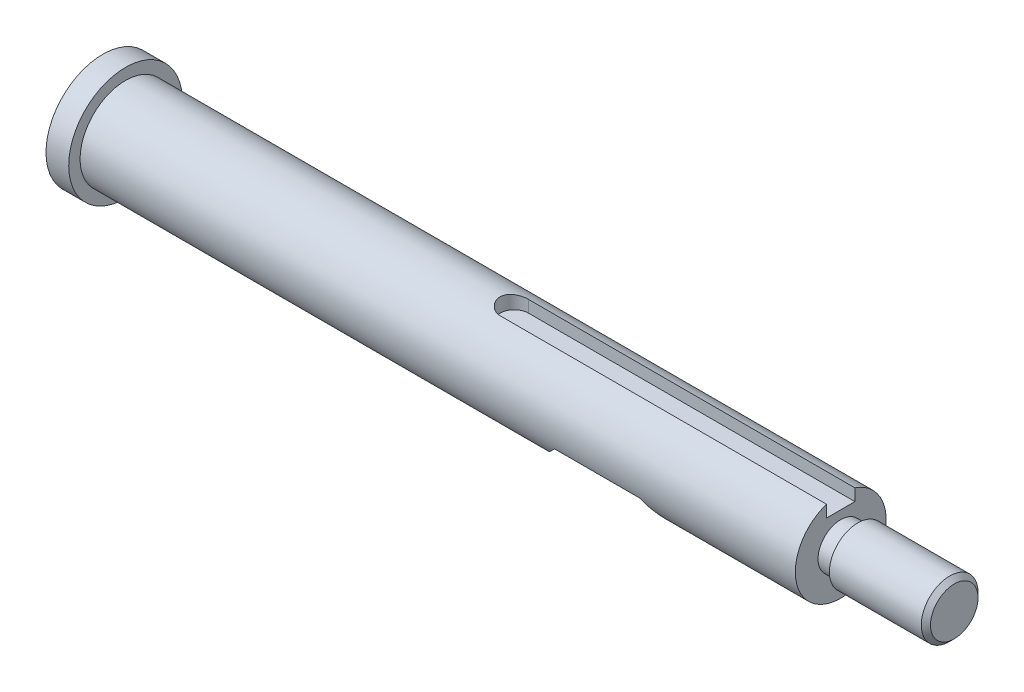
ISO-10303-21;
HEADER;
FILE_DESCRIPTION(('STEP AP214'),'2;1');
FILE_NAME('part.step','',(''),(''),'','','');
FILE_SCHEMA(('AUTOMOTIVE_DESIGN { 1 0 10303 214 1 1 1 1 }'));
ENDSEC;
DATA;
#1=APPLICATION_CONTEXT('core data for automotive mechanical design processes');
#2=APPLICATION_PROTOCOL_DEFINITION('international standard','automotive_design',2000,#1);
#3=PRODUCT_CONTEXT('',#1,'mechanical');
#4=PRODUCT('Part','Part','',(#3));
#5=PRODUCT_RELATED_PRODUCT_CATEGORY('part','',(#4));
#6=PRODUCT_DEFINITION_FORMATION('','',#4);
#7=PRODUCT_DEFINITION_CONTEXT('part definition',#1,'design');
#8=PRODUCT_DEFINITION('design','',#6,#7);
#9=PRODUCT_DEFINITION_SHAPE('','',#8);
#10=(LENGTH_UNIT() NAMED_UNIT(*) SI_UNIT(.MILLI.,.METRE.));
#11=(NAMED_UNIT(*) PLANE_ANGLE_UNIT() SI_UNIT($,.RADIAN.));
#12=(NAMED_UNIT(*) SI_UNIT($,.STERADIAN.) SOLID_ANGLE_UNIT());
#13=UNCERTAINTY_MEASURE_WITH_UNIT(LENGTH_MEASURE(1.E-05),#10,'distance_accuracy_value','');
#14=(GEOMETRIC_REPRESENTATION_CONTEXT(3) GLOBAL_UNCERTAINTY_ASSIGNED_CONTEXT((#13)) GLOBAL_UNIT_ASSIGNED_CONTEXT((#10,
#11,#12)) REPRESENTATION_CONTEXT('',''));
#15=CARTESIAN_POINT('',(0.,0.,0.));
#16=DIRECTION('',(0.,0.,1.));
#17=DIRECTION('',(1.,0.,0.));
#18=AXIS2_PLACEMENT_3D('',#15,#16,#17);
#19=CARTESIAN_POINT('',(0.,0.,0.));
#20=DIRECTION('',(-1.,0.,0.));
#21=DIRECTION('',(0.,0.,1.));
#22=AXIS2_PLACEMENT_3D('',#19,#20,#21);
#23=CYLINDRICAL_SURFACE('',#22,8.);
#24=CARTESIAN_POINT('',(90.,0.,0.));
#25=DIRECTION('',(-0.70710678118655,0.707106781186545,0.));
#26=DIRECTION('',(-0.707106781186545,-0.70710678118655,0.));
#27=AXIS2_PLACEMENT_3D('',#24,#25,#26);
#28=ELLIPSE('',#27,11.3137084989847,8.);
#29=CARTESIAN_POINT('',(87.,-3.,-7.4161984870956));
#30=VERTEX_POINT('',#29);
#31=CARTESIAN_POINT('',(87.,-3.,7.4161984870956));
#32=VERTEX_POINT('',#31);
#33=EDGE_CURVE('E11',#30,#32,#28,.T.);
#34=ORIENTED_EDGE('',*,*,#33,.T.);
#35=DIRECTION('',(-1.,0.,0.));
#36=VECTOR('',#35,1.);
#37=CARTESIAN_POINT('',(0.,-3.00000000000014,7.41619848709561));
#38=LINE('',#37,#36);
#39=CARTESIAN_POINT('',(102.,-2.99999999999998,7.41619848709568));
#40=VERTEX_POINT('',#39);
#41=EDGE_CURVE('E104',#32,#40,#38,.F.);
#42=ORIENTED_EDGE('',*,*,#41,.T.);
#43=CARTESIAN_POINT('',(99.,0.,0.));
#44=DIRECTION('',(0.707106781186549,0.707106781186547,0.));
#45=DIRECTION('',(-0.707106781186547,0.707106781186549,0.));
#46=AXIS2_PLACEMENT_3D('',#43,#44,#45);
#47=ELLIPSE('',#46,11.3137084989847,8.);
#48=CARTESIAN_POINT('',(102.,-2.99999999999998,-7.41619848709568));
#49=VERTEX_POINT('',#48);
#50=EDGE_CURVE('E99',#40,#49,#47,.T.);
#51=ORIENTED_EDGE('',*,*,#50,.T.);
#52=DIRECTION('',(-1.,0.,0.));
#53=VECTOR('',#52,1.);
#54=CARTESIAN_POINT('',(0.,-3.00000000000014,-7.41619848709561));
#55=LINE('',#54,#53);
#56=EDGE_CURVE('E53',#49,#30,#55,.T.);
#57=ORIENTED_EDGE('',*,*,#56,.T.);
#58=EDGE_LOOP('',(#34,#42,#51,#57));
#59=FACE_BOUND('',#58,.T.);
#60=CARTESIAN_POINT('',(4.,0.,0.));
#61=DIRECTION('',(-1.,0.,0.));
#62=DIRECTION('',(0.,0.,1.));
#63=AXIS2_PLACEMENT_3D('',#60,#61,#62);
#64=CIRCLE('',#63,8.);
#65=CARTESIAN_POINT('',(4.,0.,8.));
#66=VERTEX_POINT('',#65);
#67=EDGE_CURVE('E193',#66,#66,#64,.T.);
#68=ORIENTED_EDGE('',*,*,#67,.F.);
#69=EDGE_LOOP('',(#68));
#70=FACE_BOUND('',#69,.T.);
#71=DIRECTION('',(-1.,0.,0.));
#72=VECTOR('',#71,1.);
#73=CARTESIAN_POINT('',(0.,7.59934207678534,-2.49999999999998));
#74=LINE('',#73,#72);
#75=CARTESIAN_POINT('',(130.,7.59934207678533,-2.5));
#76=VERTEX_POINT('',#75);
#77=CARTESIAN_POINT('',(72.5,7.59934207678533,-2.50000000000001));
#78=VERTEX_POINT('',#77);
#79=EDGE_CURVE('E210',#76,#78,#74,.T.);
#80=ORIENTED_EDGE('',*,*,#79,.F.);
#81=CARTESIAN_POINT('',(130.,0.,0.));
#82=DIRECTION('',(-1.,0.,0.));
#83=DIRECTION('',(0.,0.,1.));
#84=AXIS2_PLACEMENT_3D('',#81,#82,#83);
#85=CIRCLE('',#84,8.);
#86=CARTESIAN_POINT('',(130.,7.59934207678533,2.5));
#87=VERTEX_POINT('',#86);
#88=EDGE_CURVE('E180',#76,#87,#85,.T.);
#89=ORIENTED_EDGE('',*,*,#88,.T.);
#90=DIRECTION('',(-1.,0.,0.));
#91=VECTOR('',#90,1.);
#92=CARTESIAN_POINT('',(0.,7.59934207678533,2.50000000000002));
#93=LINE('',#92,#91);
#94=CARTESIAN_POINT('',(72.5,7.59934207678533,2.50000000000001));
#95=VERTEX_POINT('',#94);
#96=EDGE_CURVE('E212',#95,#87,#93,.F.);
#97=ORIENTED_EDGE('',*,*,#96,.F.);
#98=CARTESIAN_POINT('',(72.5,7.59934207678533,-2.50000000000001));
#99=CARTESIAN_POINT('',(72.4315339595421,7.59933203220922,-2.50000871986612));
#100=CARTESIAN_POINT('',(72.3630736199714,7.60026710840752,-2.49718761570671));
#101=CARTESIAN_POINT('',(72.2266785097404,7.60395280971297,-2.48595363160139));
#102=CARTESIAN_POINT('',(72.1587436164041,7.60670299725467,-2.47754209932594));
#103=CARTESIAN_POINT('',(72.0240610094842,7.61393458112745,-2.45522504986813));
#104=CARTESIAN_POINT('',(71.9573105997033,7.61841131278036,-2.44133433374919));
#105=CARTESIAN_POINT('',(71.8252980221065,7.6289504842887,-2.40819742021323));
#106=CARTESIAN_POINT('',(71.7600358985911,7.63501297127917,-2.38895106360389));
#107=CARTESIAN_POINT('',(71.5672122235932,7.65531370854753,-2.32342181812058));
#108=CARTESIAN_POINT('',(71.4424319419261,7.67167572075674,-2.26931834783615));
#109=CARTESIAN_POINT('',(71.2037124302177,7.70820192005305,-2.14195853375281));
#110=CARTESIAN_POINT('',(71.0897788745153,7.72836808096862,-2.06869223942945));
#111=CARTESIAN_POINT('',(70.8720500238271,7.77100200100207,-1.90239488450143));
#112=CARTESIAN_POINT('',(70.7686777356114,7.79352168290434,-1.80882220629732));
#113=CARTESIAN_POINT('',(70.5788091827044,7.83788426191899,-1.60572727956464));
#114=CARTESIAN_POINT('',(70.4923158216107,7.85972704204464,-1.49620229248913));
#115=CARTESIAN_POINT('',(70.3367767359159,7.90087147079049,-1.26124953771774));
#116=CARTESIAN_POINT('',(70.2681699526331,7.92010445950432,-1.13551807880449));
#117=CARTESIAN_POINT('',(70.1532459150217,7.95325160259884,-0.873602960335176));
#118=CARTESIAN_POINT('',(70.106922529715,7.96716721976608,-0.737422187737953));
#119=CARTESIAN_POINT('',(70.0392981140108,7.98774341182992,-0.462930099012002));
#120=CARTESIAN_POINT('',(70.0172689552531,7.99461464054537,-0.324814247508671));
#121=CARTESIAN_POINT('',(69.9965512744954,8.00107192504111,-0.0466844774607953));
#122=CARTESIAN_POINT('',(69.9978579200948,8.00065948912979,0.0933290421121628));
#123=CARTESIAN_POINT('',(70.0232966545975,7.99274230032515,0.366149731450015));
#124=CARTESIAN_POINT('',(70.0466390281483,7.98548293529422,0.499038795981156));
#125=CARTESIAN_POINT('',(70.1141904955611,7.96498949974384,0.758907586787312));
#126=CARTESIAN_POINT('',(70.1584007112687,7.95175510801139,0.885886994958708));
#127=CARTESIAN_POINT('',(70.2669406330596,7.92046911120711,1.13215685546552));
#128=CARTESIAN_POINT('',(70.33151017529,7.90236047967987,1.25133405945159));
#129=CARTESIAN_POINT('',(70.478743196476,7.86323423851861,1.47740616192354));
#130=CARTESIAN_POINT('',(70.5614110607507,7.84221592430771,1.58429807402892));
#131=CARTESIAN_POINT('',(70.7465381363962,7.79847545376802,1.78746586607461));
#132=CARTESIAN_POINT('',(70.8496774077316,7.77571879037653,1.88311543585897));
#133=CARTESIAN_POINT('',(71.0707703101051,7.73181622612155,2.05596538849194));
#134=CARTESIAN_POINT('',(71.1887283888502,7.71067081193134,2.13316021206708));
#135=CARTESIAN_POINT('',(71.4379029431862,7.67220528704822,2.26764925997604));
#136=CARTESIAN_POINT('',(71.569258301466,7.65493278862476,2.32470027293309));
#137=CARTESIAN_POINT('',(71.8403118730475,7.62673815128782,2.41560912229749));
#138=CARTESIAN_POINT('',(71.9799968306881,7.61580620458632,2.4495027938281));
#139=CARTESIAN_POINT('',(72.1841751010083,7.60564225124819,2.48078343133094));
#140=CARTESIAN_POINT('',(72.2471449369419,7.60328541577438,2.48798807259047));
#141=CARTESIAN_POINT('',(72.3733989933458,7.60013482131108,2.49759244704774));
#142=CARTESIAN_POINT('',(72.4366826427974,7.59933885501906,2.49999896558959));
#143=CARTESIAN_POINT('',(72.5,7.59934207678533,2.49999999999999));
#144=B_SPLINE_CURVE_WITH_KNOTS('',3,(#98,#99,#100,#101,#102,#103,#104,#105,#106,#107,#108,#109,
#110,#111,#112,#113,#114,#115,#116,#117,#118,#119,#120,#121,#122,#123,#124,#125,#126,#127,#128,
#129,#130,#131,#132,#133,#134,#135,#136,#137,#138,#139,#140,#141,#142,#143),.UNSPECIFIED.,.F.,
.F.,(4,2,2,2,2,2,2,2,2,2,2,2,2,2,2,2,2,2,2,2,2,2,4),(0.,0.205323959879004,0.410598440771317,
0.615322164613769,0.820051974362703,1.22896577749256,1.63809233699274,2.05988351400979,
2.48174718582287,2.91315381297357,3.34444167638914,3.7624189439242,4.18030965733328,
4.58377069824371,4.98725343150324,5.39567896994656,5.80420358180208,6.2297165423683,
6.6553575226076,7.08597472101491,7.51592403685478,7.70602799872318,7.89586293072483),.UNSPECIFIED.);
#145=EDGE_CURVE('E105',#78,#95,#144,.T.);
#146=ORIENTED_EDGE('',*,*,#145,.F.);
#147=EDGE_LOOP('',(#80,#89,#97,#146));
#148=FACE_BOUND('',#147,.T.);
#149=ADVANCED_FACE('F45',(#59,#70,#148),#23,.T.);
#150=CARTESIAN_POINT('',(130.,8.,0.));
#151=DIRECTION('',(-1.,0.,0.));
#152=DIRECTION('',(0.,0.,1.));
#153=AXIS2_PLACEMENT_3D('',#150,#151,#152);
#154=PLANE('',#153);
#155=CARTESIAN_POINT('',(130.,0.,0.));
#156=DIRECTION('',(-1.,0.,0.));
#157=DIRECTION('',(0.,0.,1.));
#158=AXIS2_PLACEMENT_3D('',#155,#156,#157);
#159=CIRCLE('',#158,4.);
#160=CARTESIAN_POINT('',(130.,0.,4.));
#161=VERTEX_POINT('',#160);
#162=EDGE_CURVE('E173',#161,#161,#159,.T.);
#163=ORIENTED_EDGE('',*,*,#162,.T.);
#164=EDGE_LOOP('',(#163));
#165=FACE_BOUND('',#164,.T.);
#166=DIRECTION('',(0.,1.,0.));
#167=VECTOR('',#166,1.);
#168=CARTESIAN_POINT('',(130.,8.,-2.5));
#169=LINE('',#168,#167);
#170=CARTESIAN_POINT('',(130.,5.5,-2.5));
#171=VERTEX_POINT('',#170);
#172=EDGE_CURVE('E124',#171,#76,#169,.T.);
#173=ORIENTED_EDGE('',*,*,#172,.F.);
#174=DIRECTION('',(0.,0.,-1.));
#175=VECTOR('',#174,1.);
#176=CARTESIAN_POINT('',(130.,5.5,0.));
#177=LINE('',#176,#175);
#178=CARTESIAN_POINT('',(130.,5.5,2.50000000000001));
#179=VERTEX_POINT('',#178);
#180=EDGE_CURVE('E178',#179,#171,#177,.T.);
#181=ORIENTED_EDGE('',*,*,#180,.F.);
#182=DIRECTION('',(0.,-1.,0.));
#183=VECTOR('',#182,1.);
#184=CARTESIAN_POINT('',(130.,8.,2.5));
#185=LINE('',#184,#183);
#186=EDGE_CURVE('E183',#87,#179,#185,.T.);
#187=ORIENTED_EDGE('',*,*,#186,.F.);
#188=ORIENTED_EDGE('',*,*,#88,.F.);
#189=EDGE_LOOP('',(#173,#181,#187,#188));
#190=FACE_BOUND('',#189,.T.);
#191=ADVANCED_FACE('F161',(#165,#190),#154,.F.);
#192=CARTESIAN_POINT('',(0.,0.,0.));
#193=DIRECTION('',(1.,0.,0.));
#194=DIRECTION('',(0.,0.,-1.));
#195=AXIS2_PLACEMENT_3D('',#192,#193,#194);
#196=PLANE('',#195);
#197=CARTESIAN_POINT('',(0.,0.,0.));
#198=DIRECTION('',(-1.,0.,0.));
#199=DIRECTION('',(0.,0.,1.));
#200=AXIS2_PLACEMENT_3D('',#197,#198,#199);
#201=CIRCLE('',#200,5.09999999999999);
#202=CARTESIAN_POINT('',(0.,0.,5.09999999999999));
#203=VERTEX_POINT('',#202);
#204=EDGE_CURVE('E227',#203,#203,#201,.T.);
#205=ORIENTED_EDGE('',*,*,#204,.F.);
#206=EDGE_LOOP('',(#205));
#207=FACE_BOUND('',#206,.T.);
#208=CARTESIAN_POINT('',(0.,0.,0.));
#209=DIRECTION('',(-1.,0.,0.));
#210=DIRECTION('',(0.,0.,1.));
#211=AXIS2_PLACEMENT_3D('',#208,#209,#210);
#212=CIRCLE('',#211,10.);
#213=CARTESIAN_POINT('',(0.,0.,10.));
#214=VERTEX_POINT('',#213);
#215=EDGE_CURVE('E185',#214,#214,#212,.T.);
#216=ORIENTED_EDGE('',*,*,#215,.T.);
#217=EDGE_LOOP('',(#216));
#218=FACE_BOUND('',#217,.T.);
#219=ADVANCED_FACE('F47',(#207,#218),#196,.F.);
#220=CARTESIAN_POINT('',(0.,0.,0.));
#221=DIRECTION('',(-1.,0.,0.));
#222=DIRECTION('',(0.,0.,1.));
#223=AXIS2_PLACEMENT_3D('',#220,#221,#222);
#224=CYLINDRICAL_SURFACE('',#223,10.);
#225=ORIENTED_EDGE('',*,*,#215,.F.);
#226=EDGE_LOOP('',(#225));
#227=FACE_BOUND('',#226,.T.);
#228=CARTESIAN_POINT('',(4.,0.,0.));
#229=DIRECTION('',(-1.,0.,0.));
#230=DIRECTION('',(0.,0.,1.));
#231=AXIS2_PLACEMENT_3D('',#228,#229,#230);
#232=CIRCLE('',#231,10.);
#233=CARTESIAN_POINT('',(4.,0.,10.));
#234=VERTEX_POINT('',#233);
#235=EDGE_CURVE('E190',#234,#234,#232,.T.);
#236=ORIENTED_EDGE('',*,*,#235,.T.);
#237=EDGE_LOOP('',(#236));
#238=FACE_BOUND('',#237,.T.);
#239=ADVANCED_FACE('F167',(#227,#238),#224,.T.);
#240=CARTESIAN_POINT('',(4.,10.,0.));
#241=DIRECTION('',(-1.,0.,0.));
#242=DIRECTION('',(0.,0.,1.));
#243=AXIS2_PLACEMENT_3D('',#240,#241,#242);
#244=PLANE('',#243);
#245=ORIENTED_EDGE('',*,*,#235,.F.);
#246=EDGE_LOOP('',(#245));
#247=FACE_BOUND('',#246,.T.);
#248=ORIENTED_EDGE('',*,*,#67,.T.);
#249=EDGE_LOOP('',(#248));
#250=FACE_BOUND('',#249,.T.);
#251=ADVANCED_FACE('F159',(#247,#250),#244,.F.);
#252=CARTESIAN_POINT('',(0.,0.,0.));
#253=DIRECTION('',(-1.,0.,0.));
#254=DIRECTION('',(0.,0.,1.));
#255=AXIS2_PLACEMENT_3D('',#252,#253,#254);
#256=CYLINDRICAL_SURFACE('',#255,4.);
#257=ORIENTED_EDGE('',*,*,#162,.F.);
#258=EDGE_LOOP('',(#257));
#259=FACE_BOUND('',#258,.T.);
#260=CARTESIAN_POINT('',(133.,0.,0.));
#261=DIRECTION('',(-1.,0.,0.));
#262=DIRECTION('',(0.,0.,1.));
#263=AXIS2_PLACEMENT_3D('',#260,#261,#262);
#264=CIRCLE('',#263,4.);
#265=CARTESIAN_POINT('',(133.,0.,4.));
#266=VERTEX_POINT('',#265);
#267=EDGE_CURVE('E198',#266,#266,#264,.T.);
#268=ORIENTED_EDGE('',*,*,#267,.T.);
#269=EDGE_LOOP('',(#268));
#270=FACE_BOUND('',#269,.T.);
#271=ADVANCED_FACE('F156',(#259,#270),#256,.T.);
#272=CARTESIAN_POINT('',(133.,4.,0.));
#273=DIRECTION('',(1.,0.,0.));
#274=DIRECTION('',(0.,0.,-1.));
#275=AXIS2_PLACEMENT_3D('',#272,#273,#274);
#276=PLANE('',#275);
#277=ORIENTED_EDGE('',*,*,#267,.F.);
#278=EDGE_LOOP('',(#277));
#279=FACE_BOUND('',#278,.T.);
#280=CARTESIAN_POINT('',(133.,0.,0.));
#281=DIRECTION('',(-1.,0.,0.));
#282=DIRECTION('',(0.,0.,1.));
#283=AXIS2_PLACEMENT_3D('',#280,#281,#282);
#284=CIRCLE('',#283,5.);
#285=CARTESIAN_POINT('',(133.,0.,5.));
#286=VERTEX_POINT('',#285);
#287=EDGE_CURVE('E201',#286,#286,#284,.T.);
#288=ORIENTED_EDGE('',*,*,#287,.T.);
#289=EDGE_LOOP('',(#288));
#290=FACE_BOUND('',#289,.T.);
#291=ADVANCED_FACE('F152',(#279,#290),#276,.F.);
#292=CARTESIAN_POINT('',(0.,0.,0.));
#293=DIRECTION('',(-1.,0.,0.));
#294=DIRECTION('',(0.,0.,1.));
#295=AXIS2_PLACEMENT_3D('',#292,#293,#294);
#296=CYLINDRICAL_SURFACE('',#295,5.);
#297=CARTESIAN_POINT('',(149.188,0.,0.));
#298=DIRECTION('',(-1.,0.,0.));
#299=DIRECTION('',(0.,0.,1.));
#300=AXIS2_PLACEMENT_3D('',#297,#298,#299);
#301=CIRCLE('',#300,5.);
#302=CARTESIAN_POINT('',(149.188,0.,5.));
#303=VERTEX_POINT('',#302);
#304=EDGE_CURVE('E204',#303,#303,#301,.T.);
#305=ORIENTED_EDGE('',*,*,#304,.T.);
#306=EDGE_LOOP('',(#305));
#307=FACE_BOUND('',#306,.T.);
#308=ORIENTED_EDGE('',*,*,#287,.F.);
#309=EDGE_LOOP('',(#308));
#310=FACE_BOUND('',#309,.T.);
#311=ADVANCED_FACE('F145',(#307,#310),#296,.T.);
#312=CARTESIAN_POINT('',(150.,0.,0.));
#313=DIRECTION('',(-1.,0.,0.));
#314=DIRECTION('',(0.,0.,1.));
#315=AXIS2_PLACEMENT_3D('',#312,#313,#314);
#316=CONICAL_SURFACE('',#315,4.188,0.785398163397459);
#317=ORIENTED_EDGE('',*,*,#304,.F.);
#318=EDGE_LOOP('',(#317));
#319=FACE_BOUND('',#318,.T.);
#320=CARTESIAN_POINT('',(150.,0.,0.));
#321=DIRECTION('',(-1.,0.,0.));
#322=DIRECTION('',(0.,0.,1.));
#323=AXIS2_PLACEMENT_3D('',#320,#321,#322);
#324=CIRCLE('',#323,4.188);
#325=CARTESIAN_POINT('',(150.,0.,4.188));
#326=VERTEX_POINT('',#325);
#327=EDGE_CURVE('E207',#326,#326,#324,.T.);
#328=ORIENTED_EDGE('',*,*,#327,.T.);
#329=EDGE_LOOP('',(#328));
#330=FACE_BOUND('',#329,.T.);
#331=ADVANCED_FACE('F142',(#319,#330),#316,.T.);
#332=CARTESIAN_POINT('',(150.,5.,0.));
#333=DIRECTION('',(-1.,0.,0.));
#334=DIRECTION('',(0.,0.,1.));
#335=AXIS2_PLACEMENT_3D('',#332,#333,#334);
#336=PLANE('',#335);
#337=ORIENTED_EDGE('',*,*,#327,.F.);
#338=EDGE_LOOP('',(#337));
#339=FACE_BOUND('',#338,.T.);
#340=ADVANCED_FACE('F135',(#339),#336,.F.);
#341=CARTESIAN_POINT('',(72.5,10.,0.));
#342=DIRECTION('',(0.,-1.,0.));
#343=DIRECTION('',(0.,0.,-1.));
#344=AXIS2_PLACEMENT_3D('',#341,#342,#343);
#345=CYLINDRICAL_SURFACE('',#344,2.5);
#346=ORIENTED_EDGE('',*,*,#145,.T.);
#347=DIRECTION('',(0.,-1.,0.));
#348=VECTOR('',#347,1.);
#349=CARTESIAN_POINT('',(72.5,10.,2.50000000000001));
#350=LINE('',#349,#348);
#351=CARTESIAN_POINT('',(72.5,5.5,2.50000000000001));
#352=VERTEX_POINT('',#351);
#353=EDGE_CURVE('E216',#95,#352,#350,.T.);
#354=ORIENTED_EDGE('',*,*,#353,.T.);
#355=CARTESIAN_POINT('',(72.5,5.5,0.));
#356=DIRECTION('',(0.,1.,0.));
#357=DIRECTION('',(0.,0.,1.));
#358=AXIS2_PLACEMENT_3D('',#355,#356,#357);
#359=CIRCLE('',#358,2.5);
#360=CARTESIAN_POINT('',(72.5,5.5,-2.50000000000001));
#361=VERTEX_POINT('',#360);
#362=EDGE_CURVE('E219',#361,#352,#359,.T.);
#363=ORIENTED_EDGE('',*,*,#362,.F.);
#364=DIRECTION('',(0.,-1.,0.));
#365=VECTOR('',#364,1.);
#366=CARTESIAN_POINT('',(72.5,10.,-2.50000000000001));
#367=LINE('',#366,#365);
#368=EDGE_CURVE('E214',#78,#361,#367,.T.);
#369=ORIENTED_EDGE('',*,*,#368,.F.);
#370=EDGE_LOOP('',(#346,#354,#363,#369));
#371=FACE_BOUND('',#370,.T.);
#372=ADVANCED_FACE('F129',(#371),#345,.F.);
#373=CARTESIAN_POINT('',(130.,10.,-2.5));
#374=DIRECTION('',(0.,0.,1.));
#375=DIRECTION('',(1.,0.,0.));
#376=AXIS2_PLACEMENT_3D('',#373,#374,#375);
#377=PLANE('',#376);
#378=ORIENTED_EDGE('',*,*,#79,.T.);
#379=ORIENTED_EDGE('',*,*,#368,.T.);
#380=DIRECTION('',(-1.,0.,0.));
#381=VECTOR('',#380,1.);
#382=CARTESIAN_POINT('',(130.,5.5,-2.5));
#383=LINE('',#382,#381);
#384=EDGE_CURVE('E221',#171,#361,#383,.T.);
#385=ORIENTED_EDGE('',*,*,#384,.F.);
#386=ORIENTED_EDGE('',*,*,#172,.T.);
#387=EDGE_LOOP('',(#378,#379,#385,#386));
#388=FACE_BOUND('',#387,.T.);
#389=ADVANCED_FACE('F134',(#388),#377,.T.);
#390=CARTESIAN_POINT('',(130.,10.,2.5));
#391=DIRECTION('',(0.,0.,-1.));
#392=DIRECTION('',(-1.,0.,0.));
#393=AXIS2_PLACEMENT_3D('',#390,#391,#392);
#394=PLANE('',#393);
#395=ORIENTED_EDGE('',*,*,#96,.T.);
#396=ORIENTED_EDGE('',*,*,#186,.T.);
#397=DIRECTION('',(1.,0.,0.));
#398=VECTOR('',#397,1.);
#399=CARTESIAN_POINT('',(130.,5.5,2.5));
#400=LINE('',#399,#398);
#401=EDGE_CURVE('E67',#352,#179,#400,.T.);
#402=ORIENTED_EDGE('',*,*,#401,.F.);
#403=ORIENTED_EDGE('',*,*,#353,.F.);
#404=EDGE_LOOP('',(#395,#396,#402,#403));
#405=FACE_BOUND('',#404,.T.);
#406=ADVANCED_FACE('F137',(#405),#394,.T.);
#407=CARTESIAN_POINT('',(130.,5.5,0.));
#408=DIRECTION('',(0.,1.,0.));
#409=DIRECTION('',(0.,0.,1.));
#410=AXIS2_PLACEMENT_3D('',#407,#408,#409);
#411=PLANE('',#410);
#412=ORIENTED_EDGE('',*,*,#180,.T.);
#413=ORIENTED_EDGE('',*,*,#384,.T.);
#414=ORIENTED_EDGE('',*,*,#362,.T.);
#415=ORIENTED_EDGE('',*,*,#401,.T.);
#416=EDGE_LOOP('',(#412,#413,#414,#415));
#417=FACE_BOUND('',#416,.T.);
#418=ADVANCED_FACE('F246',(#417),#411,.T.);
#419=CARTESIAN_POINT('',(60.,0.,0.));
#420=DIRECTION('',(-1.,0.,0.));
#421=DIRECTION('',(0.,0.,1.));
#422=AXIS2_PLACEMENT_3D('',#419,#420,#421);
#423=CONICAL_SURFACE('',#422,5.09999999999999,1.02974425867665);
#424=CARTESIAN_POINT('',(63.0643891570406,0.,0.));
#425=VERTEX_POINT('',#424);
#426=VERTEX_LOOP('',#425);
#427=FACE_BOUND('',#426,.T.);
#428=CARTESIAN_POINT('',(60.,0.,0.));
#429=DIRECTION('',(-1.,0.,0.));
#430=DIRECTION('',(0.,0.,1.));
#431=AXIS2_PLACEMENT_3D('',#428,#429,#430);
#432=CIRCLE('',#431,5.09999999999999);
#433=CARTESIAN_POINT('',(60.,0.,5.09999999999999));
#434=VERTEX_POINT('',#433);
#435=EDGE_CURVE('E224',#434,#434,#432,.T.);
#436=ORIENTED_EDGE('',*,*,#435,.T.);
#437=EDGE_LOOP('',(#436));
#438=FACE_BOUND('',#437,.T.);
#439=ADVANCED_FACE('F240',(#427,#438),#423,.F.);
#440=CARTESIAN_POINT('',(0.,0.,0.));
#441=DIRECTION('',(-1.,0.,0.));
#442=DIRECTION('',(0.,0.,1.));
#443=AXIS2_PLACEMENT_3D('',#440,#441,#442);
#444=CYLINDRICAL_SURFACE('',#443,5.09999999999999);
#445=ORIENTED_EDGE('',*,*,#435,.F.);
#446=EDGE_LOOP('',(#445));
#447=FACE_BOUND('',#446,.T.);
#448=ORIENTED_EDGE('',*,*,#204,.T.);
#449=EDGE_LOOP('',(#448));
#450=FACE_BOUND('',#449,.T.);
#451=ADVANCED_FACE('F233',(#447,#450),#444,.F.);
#452=CARTESIAN_POINT('',(82.,-8.,200.804219030922));
#453=DIRECTION('',(-0.70710678118655,0.707106781186545,0.));
#454=DIRECTION('',(-0.707106781186545,-0.70710678118655,0.));
#455=AXIS2_PLACEMENT_3D('',#452,#453,#454);
#456=PLANE('',#455);
#457=DIRECTION('',(0.,0.,-1.));
#458=VECTOR('',#457,1.);
#459=CARTESIAN_POINT('',(87.,-3.,200.804219030922));
#460=LINE('',#459,#458);
#461=EDGE_CURVE('E112',#32,#30,#460,.T.);
#462=ORIENTED_EDGE('',*,*,#461,.F.);
#463=ORIENTED_EDGE('',*,*,#33,.F.);
#464=EDGE_LOOP('',(#462,#463));
#465=FACE_BOUND('',#464,.T.);
#466=ADVANCED_FACE('F231',(#465),#456,.F.);
#467=CARTESIAN_POINT('',(87.,-3.,200.804219030922));
#468=DIRECTION('',(0.,1.,0.));
#469=DIRECTION('',(-1.,0.,0.));
#470=AXIS2_PLACEMENT_3D('',#467,#468,#469);
#471=PLANE('',#470);
#472=ORIENTED_EDGE('',*,*,#56,.F.);
#473=DIRECTION('',(0.,0.,-1.));
#474=VECTOR('',#473,1.);
#475=CARTESIAN_POINT('',(102.,-2.99999999999998,200.804219030922));
#476=LINE('',#475,#474);
#477=EDGE_CURVE('E59',#40,#49,#476,.T.);
#478=ORIENTED_EDGE('',*,*,#477,.F.);
#479=ORIENTED_EDGE('',*,*,#41,.F.);
#480=ORIENTED_EDGE('',*,*,#461,.T.);
#481=EDGE_LOOP('',(#472,#478,#479,#480));
#482=FACE_BOUND('',#481,.T.);
#483=ADVANCED_FACE('F109',(#482),#471,.F.);
#484=CARTESIAN_POINT('',(102.,-2.99999999999998,200.804219030922));
#485=DIRECTION('',(0.707106781186549,0.707106781186547,0.));
#486=DIRECTION('',(-0.707106781186547,0.707106781186549,0.));
#487=AXIS2_PLACEMENT_3D('',#484,#485,#486);
#488=PLANE('',#487);
#489=ORIENTED_EDGE('',*,*,#50,.F.);
#490=ORIENTED_EDGE('',*,*,#477,.T.);
#491=EDGE_LOOP('',(#489,#490));
#492=FACE_BOUND('',#491,.T.);
#493=ADVANCED_FACE('F100',(#492),#488,.F.);
#494=CLOSED_SHELL('',(#149,#191,#219,#239,#251,#271,#291,#311,#331,#340,#372,#389,#406,#418,
#439,#451,#466,#483,#493));
#495=MANIFOLD_SOLID_BREP('B2',#494);
#496=ADVANCED_BREP_SHAPE_REPRESENTATION('',(#18,#495),#14);
#497=SHAPE_DEFINITION_REPRESENTATION(#9,#496);
ENDSEC;
END-ISO-10303-21;
